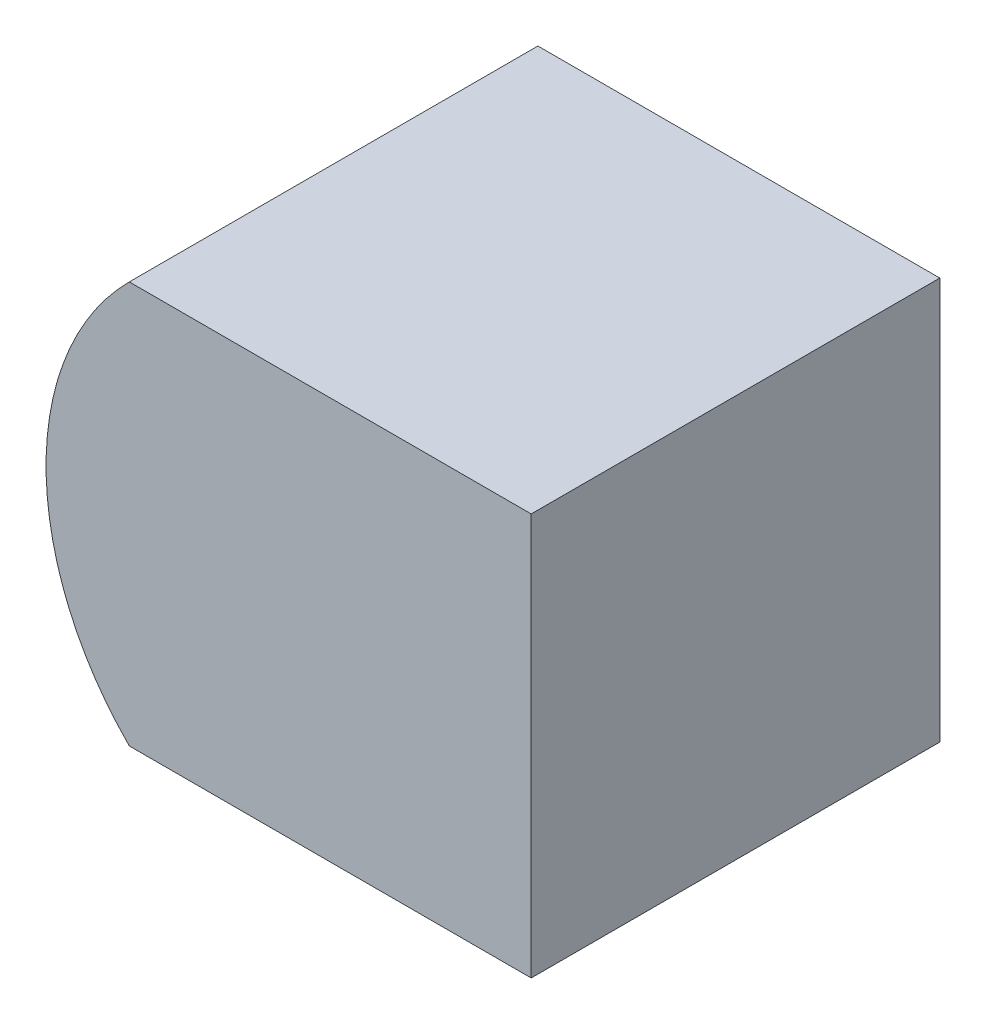
ISO-10303-21;
HEADER;
FILE_DESCRIPTION(('STEP AP214'),'2;1');
FILE_NAME('part.step','',(''),(''),'','','');
FILE_SCHEMA(('AUTOMOTIVE_DESIGN { 1 0 10303 214 1 1 1 1 }'));
ENDSEC;
DATA;
#1=APPLICATION_CONTEXT('core data for automotive mechanical design processes');
#2=APPLICATION_PROTOCOL_DEFINITION('international standard','automotive_design',2000,#1);
#3=PRODUCT_CONTEXT('',#1,'mechanical');
#4=PRODUCT('Part','Part','',(#3));
#5=PRODUCT_RELATED_PRODUCT_CATEGORY('part','',(#4));
#6=PRODUCT_DEFINITION_FORMATION('','',#4);
#7=PRODUCT_DEFINITION_CONTEXT('part definition',#1,'design');
#8=PRODUCT_DEFINITION('design','',#6,#7);
#9=PRODUCT_DEFINITION_SHAPE('','',#8);
#10=(LENGTH_UNIT() NAMED_UNIT(*) SI_UNIT(.MILLI.,.METRE.));
#11=(NAMED_UNIT(*) PLANE_ANGLE_UNIT() SI_UNIT($,.RADIAN.));
#12=(NAMED_UNIT(*) SI_UNIT($,.STERADIAN.) SOLID_ANGLE_UNIT());
#13=UNCERTAINTY_MEASURE_WITH_UNIT(LENGTH_MEASURE(1.E-05),#10,'distance_accuracy_value','');
#14=(GEOMETRIC_REPRESENTATION_CONTEXT(3) GLOBAL_UNCERTAINTY_ASSIGNED_CONTEXT((#13)) GLOBAL_UNIT_ASSIGNED_CONTEXT((#10,
#11,#12)) REPRESENTATION_CONTEXT('',''));
#15=CARTESIAN_POINT('',(0.,0.,0.));
#16=DIRECTION('',(0.,0.,1.));
#17=DIRECTION('',(1.,0.,0.));
#18=AXIS2_PLACEMENT_3D('',#15,#16,#17);
#19=CARTESIAN_POINT('',(30.,30.,61.));
#20=DIRECTION('',(-1.,0.,0.));
#21=DIRECTION('',(0.,-1.,0.));
#22=AXIS2_PLACEMENT_3D('',#19,#20,#21);
#23=PLANE('',#22);
#24=DIRECTION('',(0.,1.,0.));
#25=VECTOR('',#24,1.);
#26=CARTESIAN_POINT('',(30.,30.,0.));
#27=LINE('',#26,#25);
#28=CARTESIAN_POINT('',(30.,-30.,0.));
#29=VERTEX_POINT('',#28);
#30=CARTESIAN_POINT('',(30.,30.,0.));
#31=VERTEX_POINT('',#30);
#32=EDGE_CURVE('E96',#29,#31,#27,.T.);
#33=ORIENTED_EDGE('',*,*,#32,.T.);
#34=DIRECTION('',(0.,0.,-1.));
#35=VECTOR('',#34,1.);
#36=CARTESIAN_POINT('',(30.,30.,61.));
#37=LINE('',#36,#35);
#38=CARTESIAN_POINT('',(30.,30.,61.));
#39=VERTEX_POINT('',#38);
#40=EDGE_CURVE('E11',#39,#31,#37,.T.);
#41=ORIENTED_EDGE('',*,*,#40,.F.);
#42=DIRECTION('',(0.,1.,0.));
#43=VECTOR('',#42,1.);
#44=CARTESIAN_POINT('',(30.,30.,61.));
#45=LINE('',#44,#43);
#46=CARTESIAN_POINT('',(30.,-30.,61.));
#47=VERTEX_POINT('',#46);
#48=EDGE_CURVE('E84',#47,#39,#45,.T.);
#49=ORIENTED_EDGE('',*,*,#48,.F.);
#50=DIRECTION('',(0.,0.,-1.));
#51=VECTOR('',#50,1.);
#52=CARTESIAN_POINT('',(30.,-30.,61.));
#53=LINE('',#52,#51);
#54=EDGE_CURVE('E92',#47,#29,#53,.T.);
#55=ORIENTED_EDGE('',*,*,#54,.T.);
#56=EDGE_LOOP('',(#33,#41,#49,#55));
#57=FACE_BOUND('',#56,.T.);
#58=ADVANCED_FACE('F33',(#57),#23,.F.);
#59=CARTESIAN_POINT('',(-30.,30.,61.));
#60=DIRECTION('',(0.,-1.,0.));
#61=DIRECTION('',(0.,0.,-1.));
#62=AXIS2_PLACEMENT_3D('',#59,#60,#61);
#63=PLANE('',#62);
#64=DIRECTION('',(-1.,0.,0.));
#65=VECTOR('',#64,1.);
#66=CARTESIAN_POINT('',(-30.,30.,0.));
#67=LINE('',#66,#65);
#68=CARTESIAN_POINT('',(-30.,30.,0.));
#69=VERTEX_POINT('',#68);
#70=EDGE_CURVE('E88',#31,#69,#67,.T.);
#71=ORIENTED_EDGE('',*,*,#70,.T.);
#72=DIRECTION('',(0.,0.,-1.));
#73=VECTOR('',#72,1.);
#74=CARTESIAN_POINT('',(-30.,30.,61.));
#75=LINE('',#74,#73);
#76=CARTESIAN_POINT('',(-30.,30.,61.));
#77=VERTEX_POINT('',#76);
#78=EDGE_CURVE('E41',#77,#69,#75,.T.);
#79=ORIENTED_EDGE('',*,*,#78,.F.);
#80=DIRECTION('',(-1.,0.,0.));
#81=VECTOR('',#80,1.);
#82=CARTESIAN_POINT('',(-30.,30.,61.));
#83=LINE('',#82,#81);
#84=EDGE_CURVE('E79',#39,#77,#83,.T.);
#85=ORIENTED_EDGE('',*,*,#84,.F.);
#86=ORIENTED_EDGE('',*,*,#40,.T.);
#87=EDGE_LOOP('',(#71,#79,#85,#86));
#88=FACE_BOUND('',#87,.T.);
#89=ADVANCED_FACE('F87',(#88),#63,.F.);
#90=CARTESIAN_POINT('',(0.,0.,61.));
#91=DIRECTION('',(0.,0.,-1.));
#92=DIRECTION('',(-1.,0.,0.));
#93=AXIS2_PLACEMENT_3D('',#90,#91,#92);
#94=CYLINDRICAL_SURFACE('',#93,42.4264068711928);
#95=CARTESIAN_POINT('',(0.,0.,0.));
#96=DIRECTION('',(0.,0.,1.));
#97=DIRECTION('',(1.,0.,0.));
#98=AXIS2_PLACEMENT_3D('',#95,#96,#97);
#99=CIRCLE('',#98,42.4264068711928);
#100=CARTESIAN_POINT('',(-30.,-30.,0.));
#101=VERTEX_POINT('',#100);
#102=EDGE_CURVE('E66',#69,#101,#99,.T.);
#103=ORIENTED_EDGE('',*,*,#102,.T.);
#104=DIRECTION('',(0.,0.,-1.));
#105=VECTOR('',#104,1.);
#106=CARTESIAN_POINT('',(-30.,-30.,61.));
#107=LINE('',#106,#105);
#108=CARTESIAN_POINT('',(-30.,-30.,61.));
#109=VERTEX_POINT('',#108);
#110=EDGE_CURVE('E89',#109,#101,#107,.T.);
#111=ORIENTED_EDGE('',*,*,#110,.F.);
#112=CARTESIAN_POINT('',(0.,0.,61.));
#113=DIRECTION('',(0.,0.,1.));
#114=DIRECTION('',(1.,0.,0.));
#115=AXIS2_PLACEMENT_3D('',#112,#113,#114);
#116=CIRCLE('',#115,42.4264068711928);
#117=EDGE_CURVE('E82',#77,#109,#116,.T.);
#118=ORIENTED_EDGE('',*,*,#117,.F.);
#119=ORIENTED_EDGE('',*,*,#78,.T.);
#120=EDGE_LOOP('',(#103,#111,#118,#119));
#121=FACE_BOUND('',#120,.T.);
#122=ADVANCED_FACE('F90',(#121),#94,.T.);
#123=CARTESIAN_POINT('',(-30.,-30.,61.));
#124=DIRECTION('',(0.,1.,0.));
#125=DIRECTION('',(0.,0.,1.));
#126=AXIS2_PLACEMENT_3D('',#123,#124,#125);
#127=PLANE('',#126);
#128=DIRECTION('',(1.,0.,0.));
#129=VECTOR('',#128,1.);
#130=CARTESIAN_POINT('',(-30.,-30.,0.));
#131=LINE('',#130,#129);
#132=EDGE_CURVE('E72',#101,#29,#131,.T.);
#133=ORIENTED_EDGE('',*,*,#132,.T.);
#134=ORIENTED_EDGE('',*,*,#54,.F.);
#135=DIRECTION('',(1.,0.,0.));
#136=VECTOR('',#135,1.);
#137=CARTESIAN_POINT('',(-30.,-30.,61.));
#138=LINE('',#137,#136);
#139=EDGE_CURVE('E49',#109,#47,#138,.T.);
#140=ORIENTED_EDGE('',*,*,#139,.F.);
#141=ORIENTED_EDGE('',*,*,#110,.T.);
#142=EDGE_LOOP('',(#133,#134,#140,#141));
#143=FACE_BOUND('',#142,.T.);
#144=ADVANCED_FACE('F103',(#143),#127,.F.);
#145=CARTESIAN_POINT('',(0.,0.,61.));
#146=DIRECTION('',(0.,0.,1.));
#147=DIRECTION('',(1.,0.,0.));
#148=AXIS2_PLACEMENT_3D('',#145,#146,#147);
#149=PLANE('',#148);
#150=ORIENTED_EDGE('',*,*,#48,.T.);
#151=ORIENTED_EDGE('',*,*,#84,.T.);
#152=ORIENTED_EDGE('',*,*,#117,.T.);
#153=ORIENTED_EDGE('',*,*,#139,.T.);
#154=EDGE_LOOP('',(#150,#151,#152,#153));
#155=FACE_BOUND('',#154,.T.);
#156=ADVANCED_FACE('F80',(#155),#149,.T.);
#157=CARTESIAN_POINT('',(0.,0.,0.));
#158=DIRECTION('',(0.,0.,1.));
#159=DIRECTION('',(1.,0.,0.));
#160=AXIS2_PLACEMENT_3D('',#157,#158,#159);
#161=PLANE('',#160);
#162=ORIENTED_EDGE('',*,*,#32,.F.);
#163=ORIENTED_EDGE('',*,*,#132,.F.);
#164=ORIENTED_EDGE('',*,*,#102,.F.);
#165=ORIENTED_EDGE('',*,*,#70,.F.);
#166=EDGE_LOOP('',(#162,#163,#164,#165));
#167=FACE_BOUND('',#166,.T.);
#168=ADVANCED_FACE('F106',(#167),#161,.F.);
#169=CLOSED_SHELL('',(#58,#89,#122,#144,#156,#168));
#170=MANIFOLD_SOLID_BREP('B2',#169);
#171=ADVANCED_BREP_SHAPE_REPRESENTATION('',(#18,#170),#14);
#172=SHAPE_DEFINITION_REPRESENTATION(#9,#171);
ENDSEC;
END-ISO-10303-21;
